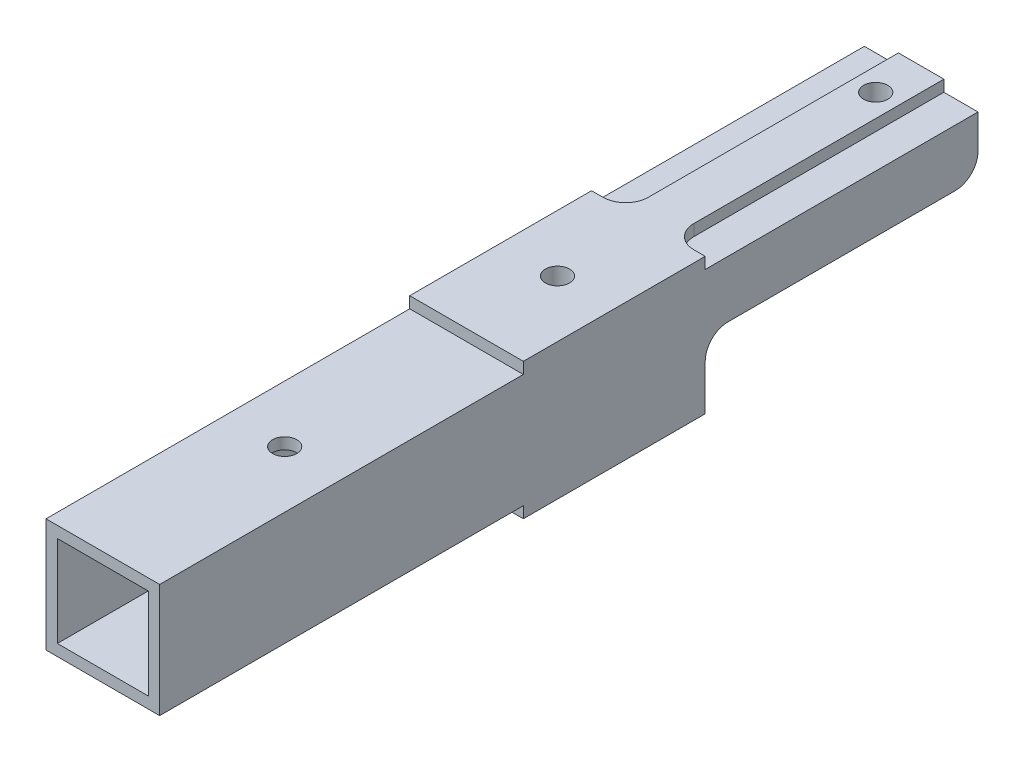
ISO-10303-21;
HEADER;
FILE_DESCRIPTION(('STEP AP214'),'2;1');
FILE_NAME('part.step','',(''),(''),'','','');
FILE_SCHEMA(('AUTOMOTIVE_DESIGN { 1 0 10303 214 1 1 1 1 }'));
ENDSEC;
DATA;
#1=APPLICATION_CONTEXT('core data for automotive mechanical design processes');
#2=APPLICATION_PROTOCOL_DEFINITION('international standard','automotive_design',2000,#1);
#3=PRODUCT_CONTEXT('',#1,'mechanical');
#4=PRODUCT('Part','Part','',(#3));
#5=PRODUCT_RELATED_PRODUCT_CATEGORY('part','',(#4));
#6=PRODUCT_DEFINITION_FORMATION('','',#4);
#7=PRODUCT_DEFINITION_CONTEXT('part definition',#1,'design');
#8=PRODUCT_DEFINITION('design','',#6,#7);
#9=PRODUCT_DEFINITION_SHAPE('','',#8);
#10=(LENGTH_UNIT() NAMED_UNIT(*) SI_UNIT(.MILLI.,.METRE.));
#11=(NAMED_UNIT(*) PLANE_ANGLE_UNIT() SI_UNIT($,.RADIAN.));
#12=(NAMED_UNIT(*) SI_UNIT($,.STERADIAN.) SOLID_ANGLE_UNIT());
#13=UNCERTAINTY_MEASURE_WITH_UNIT(LENGTH_MEASURE(1.E-05),#10,'distance_accuracy_value','');
#14=(GEOMETRIC_REPRESENTATION_CONTEXT(3) GLOBAL_UNCERTAINTY_ASSIGNED_CONTEXT((#13)) GLOBAL_UNIT_ASSIGNED_CONTEXT((#10,
#11,#12)) REPRESENTATION_CONTEXT('',''));
#15=CARTESIAN_POINT('',(0.,0.,0.));
#16=DIRECTION('',(0.,0.,1.));
#17=DIRECTION('',(1.,0.,0.));
#18=AXIS2_PLACEMENT_3D('',#15,#16,#17);
#19=CARTESIAN_POINT('',(-19.05,-19.05,-228.6));
#20=DIRECTION('',(0.,-1.,0.));
#21=DIRECTION('',(0.,0.,-1.));
#22=AXIS2_PLACEMENT_3D('',#19,#20,#21);
#23=PLANE('',#22);
#24=DIRECTION('',(0.,0.,-1.));
#25=VECTOR('',#24,1.);
#26=CARTESIAN_POINT('',(-15.875,-19.05,0.));
#27=LINE('',#26,#25);
#28=CARTESIAN_POINT('',(-15.875,-19.05,-101.6));
#29=VERTEX_POINT('',#28);
#30=CARTESIAN_POINT('',(-15.875,-19.05,-152.4));
#31=VERTEX_POINT('',#30);
#32=EDGE_CURVE('E357',#29,#31,#27,.T.);
#33=ORIENTED_EDGE('',*,*,#32,.T.);
#34=DIRECTION('',(1.,0.,0.));
#35=VECTOR('',#34,1.);
#36=CARTESIAN_POINT('',(19.05,-19.05,-152.4));
#37=LINE('',#36,#35);
#38=CARTESIAN_POINT('',(15.875,-19.05,-152.4));
#39=VERTEX_POINT('',#38);
#40=EDGE_CURVE('E402',#31,#39,#37,.T.);
#41=ORIENTED_EDGE('',*,*,#40,.T.);
#42=DIRECTION('',(0.,0.,-1.));
#43=VECTOR('',#42,1.);
#44=CARTESIAN_POINT('',(15.875,-19.05,0.));
#45=LINE('',#44,#43);
#46=CARTESIAN_POINT('',(15.875,-19.05,-101.6));
#47=VERTEX_POINT('',#46);
#48=EDGE_CURVE('E335',#47,#39,#45,.T.);
#49=ORIENTED_EDGE('',*,*,#48,.F.);
#50=DIRECTION('',(-1.,0.,0.));
#51=VECTOR('',#50,1.);
#52=CARTESIAN_POINT('',(-19.05,-19.05,-101.6));
#53=LINE('',#52,#51);
#54=EDGE_CURVE('E405',#47,#29,#53,.T.);
#55=ORIENTED_EDGE('',*,*,#54,.T.);
#56=EDGE_LOOP('',(#33,#41,#49,#55));
#57=FACE_BOUND('',#56,.T.);
#58=CARTESIAN_POINT('',(0.,-19.05,-127.));
#59=DIRECTION('',(0.,1.,0.));
#60=DIRECTION('',(0.,0.,1.));
#61=AXIS2_PLACEMENT_3D('',#58,#59,#60);
#62=CIRCLE('',#61,3.37819999999999);
#63=CARTESIAN_POINT('',(0.,-19.05,-123.6218));
#64=VERTEX_POINT('',#63);
#65=EDGE_CURVE('E453',#64,#64,#62,.T.);
#66=ORIENTED_EDGE('',*,*,#65,.T.);
#67=EDGE_LOOP('',(#66));
#68=FACE_BOUND('',#67,.T.);
#69=ADVANCED_FACE('F32',(#57,#68),#23,.T.);
#70=CARTESIAN_POINT('',(19.05,19.05,-228.6));
#71=DIRECTION('',(0.,0.,-1.));
#72=DIRECTION('',(-1.,0.,0.));
#73=AXIS2_PLACEMENT_3D('',#70,#71,#72);
#74=PLANE('',#73);
#75=DIRECTION('',(0.,-1.,0.));
#76=VECTOR('',#75,1.);
#77=CARTESIAN_POINT('',(-12.7,-12.7,-228.6));
#78=LINE('',#77,#76);
#79=CARTESIAN_POINT('',(-12.7,12.7,-228.6));
#80=VERTEX_POINT('',#79);
#81=CARTESIAN_POINT('',(-12.7,6.34999999999999,-228.6));
#82=VERTEX_POINT('',#81);
#83=EDGE_CURVE('E463',#80,#82,#78,.T.);
#84=ORIENTED_EDGE('',*,*,#83,.T.);
#85=DIRECTION('',(1.,0.,0.));
#86=VECTOR('',#85,1.);
#87=CARTESIAN_POINT('',(-15.875,6.34999999999999,-228.6));
#88=LINE('',#87,#86);
#89=CARTESIAN_POINT('',(-15.875,6.34999999999999,-228.6));
#90=VERTEX_POINT('',#89);
#91=EDGE_CURVE('E315',#82,#90,#88,.F.);
#92=ORIENTED_EDGE('',*,*,#91,.T.);
#93=DIRECTION('',(0.,1.,0.));
#94=VECTOR('',#93,1.);
#95=CARTESIAN_POINT('',(-15.875,19.05,-228.6));
#96=LINE('',#95,#94);
#97=CARTESIAN_POINT('',(-15.875,15.875,-228.6));
#98=VERTEX_POINT('',#97);
#99=EDGE_CURVE('E355',#90,#98,#96,.T.);
#100=ORIENTED_EDGE('',*,*,#99,.T.);
#101=DIRECTION('',(-1.,0.,0.));
#102=VECTOR('',#101,1.);
#103=CARTESIAN_POINT('',(-19.05,15.875,-228.6));
#104=LINE('',#103,#102);
#105=CARTESIAN_POINT('',(-6.34999999999997,15.875,-228.6));
#106=VERTEX_POINT('',#105);
#107=EDGE_CURVE('E437',#106,#98,#104,.T.);
#108=ORIENTED_EDGE('',*,*,#107,.F.);
#109=DIRECTION('',(0.,1.,0.));
#110=VECTOR('',#109,1.);
#111=CARTESIAN_POINT('',(-6.34999999999999,15.875,-228.6));
#112=LINE('',#111,#110);
#113=CARTESIAN_POINT('',(-6.34999999999999,19.05,-228.6));
#114=VERTEX_POINT('',#113);
#115=EDGE_CURVE('E440',#106,#114,#112,.T.);
#116=ORIENTED_EDGE('',*,*,#115,.T.);
#117=DIRECTION('',(-1.,0.,0.));
#118=VECTOR('',#117,1.);
#119=CARTESIAN_POINT('',(-19.05,19.05,-228.6));
#120=LINE('',#119,#118);
#121=CARTESIAN_POINT('',(6.35,19.05,-228.6));
#122=VERTEX_POINT('',#121);
#123=EDGE_CURVE('E251',#122,#114,#120,.T.);
#124=ORIENTED_EDGE('',*,*,#123,.F.);
#125=DIRECTION('',(0.,1.,0.));
#126=VECTOR('',#125,1.);
#127=CARTESIAN_POINT('',(6.35,15.875,-228.6));
#128=LINE('',#127,#126);
#129=CARTESIAN_POINT('',(6.35,15.875,-228.6));
#130=VERTEX_POINT('',#129);
#131=EDGE_CURVE('E419',#130,#122,#128,.T.);
#132=ORIENTED_EDGE('',*,*,#131,.F.);
#133=DIRECTION('',(-1.,0.,0.));
#134=VECTOR('',#133,1.);
#135=CARTESIAN_POINT('',(19.05,15.875,-228.6));
#136=LINE('',#135,#134);
#137=CARTESIAN_POINT('',(15.875,15.875,-228.6));
#138=VERTEX_POINT('',#137);
#139=EDGE_CURVE('E333',#138,#130,#136,.T.);
#140=ORIENTED_EDGE('',*,*,#139,.F.);
#141=DIRECTION('',(0.,1.,0.));
#142=VECTOR('',#141,1.);
#143=CARTESIAN_POINT('',(15.875,19.05,-228.6));
#144=LINE('',#143,#142);
#145=CARTESIAN_POINT('',(15.875,6.34999999999999,-228.6));
#146=VERTEX_POINT('',#145);
#147=EDGE_CURVE('E325',#146,#138,#144,.T.);
#148=ORIENTED_EDGE('',*,*,#147,.F.);
#149=DIRECTION('',(1.,0.,0.));
#150=VECTOR('',#149,1.);
#151=CARTESIAN_POINT('',(12.7,6.34999999999999,-228.6));
#152=LINE('',#151,#150);
#153=CARTESIAN_POINT('',(12.7,6.34999999999999,-228.6));
#154=VERTEX_POINT('',#153);
#155=EDGE_CURVE('E313',#146,#154,#152,.F.);
#156=ORIENTED_EDGE('',*,*,#155,.T.);
#157=DIRECTION('',(0.,1.,0.));
#158=VECTOR('',#157,1.);
#159=CARTESIAN_POINT('',(12.7,-12.7,-228.6));
#160=LINE('',#159,#158);
#161=CARTESIAN_POINT('',(12.7,12.7,-228.6));
#162=VERTEX_POINT('',#161);
#163=EDGE_CURVE('E465',#154,#162,#160,.T.);
#164=ORIENTED_EDGE('',*,*,#163,.T.);
#165=DIRECTION('',(-1.,0.,0.));
#166=VECTOR('',#165,1.);
#167=CARTESIAN_POINT('',(-12.7,12.7,-228.6));
#168=LINE('',#167,#166);
#169=EDGE_CURVE('E247',#162,#80,#168,.T.);
#170=ORIENTED_EDGE('',*,*,#169,.T.);
#171=EDGE_LOOP('',(#84,#92,#100,#108,#116,#124,#132,#140,#148,#156,#164,#170));
#172=FACE_BOUND('',#171,.T.);
#173=ADVANCED_FACE('F331',(#172),#74,.T.);
#174=CARTESIAN_POINT('',(19.05,19.05,0.));
#175=DIRECTION('',(0.,0.,-1.));
#176=DIRECTION('',(-1.,0.,0.));
#177=AXIS2_PLACEMENT_3D('',#174,#175,#176);
#178=PLANE('',#177);
#179=DIRECTION('',(1.,0.,0.));
#180=VECTOR('',#179,1.);
#181=CARTESIAN_POINT('',(-12.7,-12.7,0.));
#182=LINE('',#181,#180);
#183=CARTESIAN_POINT('',(-12.7,-12.7,0.));
#184=VERTEX_POINT('',#183);
#185=CARTESIAN_POINT('',(12.7,-12.7,0.));
#186=VERTEX_POINT('',#185);
#187=EDGE_CURVE('E240',#184,#186,#182,.T.);
#188=ORIENTED_EDGE('',*,*,#187,.F.);
#189=DIRECTION('',(0.,-1.,0.));
#190=VECTOR('',#189,1.);
#191=CARTESIAN_POINT('',(-12.7,-12.7,0.));
#192=LINE('',#191,#190);
#193=CARTESIAN_POINT('',(-12.7,12.7,0.));
#194=VERTEX_POINT('',#193);
#195=EDGE_CURVE('E462',#194,#184,#192,.T.);
#196=ORIENTED_EDGE('',*,*,#195,.F.);
#197=DIRECTION('',(-1.,0.,0.));
#198=VECTOR('',#197,1.);
#199=CARTESIAN_POINT('',(-12.7,12.7,0.));
#200=LINE('',#199,#198);
#201=CARTESIAN_POINT('',(12.7,12.7,0.));
#202=VERTEX_POINT('',#201);
#203=EDGE_CURVE('E466',#202,#194,#200,.T.);
#204=ORIENTED_EDGE('',*,*,#203,.F.);
#205=DIRECTION('',(0.,1.,0.));
#206=VECTOR('',#205,1.);
#207=CARTESIAN_POINT('',(12.7,-12.7,0.));
#208=LINE('',#207,#206);
#209=EDGE_CURVE('E473',#186,#202,#208,.T.);
#210=ORIENTED_EDGE('',*,*,#209,.F.);
#211=EDGE_LOOP('',(#188,#196,#204,#210));
#212=FACE_BOUND('',#211,.T.);
#213=DIRECTION('',(0.,-1.,0.));
#214=VECTOR('',#213,1.);
#215=CARTESIAN_POINT('',(-15.875,19.05,0.));
#216=LINE('',#215,#214);
#217=CARTESIAN_POINT('',(-15.875,15.875,0.));
#218=VERTEX_POINT('',#217);
#219=CARTESIAN_POINT('',(-15.875,-15.875,0.));
#220=VERTEX_POINT('',#219);
#221=EDGE_CURVE('E349',#218,#220,#216,.T.);
#222=ORIENTED_EDGE('',*,*,#221,.T.);
#223=DIRECTION('',(1.,0.,0.));
#224=VECTOR('',#223,1.);
#225=CARTESIAN_POINT('',(-19.05,-15.875,0.));
#226=LINE('',#225,#224);
#227=CARTESIAN_POINT('',(15.875,-15.875,0.));
#228=VERTEX_POINT('',#227);
#229=EDGE_CURVE('E272',#220,#228,#226,.T.);
#230=ORIENTED_EDGE('',*,*,#229,.T.);
#231=DIRECTION('',(0.,-1.,0.));
#232=VECTOR('',#231,1.);
#233=CARTESIAN_POINT('',(15.875,19.05,0.));
#234=LINE('',#233,#232);
#235=CARTESIAN_POINT('',(15.875,15.875,0.));
#236=VERTEX_POINT('',#235);
#237=EDGE_CURVE('E378',#236,#228,#234,.T.);
#238=ORIENTED_EDGE('',*,*,#237,.F.);
#239=DIRECTION('',(1.,0.,0.));
#240=VECTOR('',#239,1.);
#241=CARTESIAN_POINT('',(-19.05,15.875,0.));
#242=LINE('',#241,#240);
#243=EDGE_CURVE('E425',#218,#236,#242,.T.);
#244=ORIENTED_EDGE('',*,*,#243,.F.);
#245=EDGE_LOOP('',(#222,#230,#238,#244));
#246=FACE_BOUND('',#245,.T.);
#247=ADVANCED_FACE('F486',(#212,#246),#178,.F.);
#248=CARTESIAN_POINT('',(-19.05,19.05,-228.6));
#249=DIRECTION('',(0.,1.,0.));
#250=DIRECTION('',(0.,0.,1.));
#251=AXIS2_PLACEMENT_3D('',#248,#249,#250);
#252=PLANE('',#251);
#253=CARTESIAN_POINT('',(0.,19.05,-215.9));
#254=DIRECTION('',(0.,1.,0.));
#255=DIRECTION('',(0.,0.,1.));
#256=AXIS2_PLACEMENT_3D('',#253,#254,#255);
#257=CIRCLE('',#256,3.37819999999999);
#258=CARTESIAN_POINT('',(0.,19.05,-212.5218));
#259=VERTEX_POINT('',#258);
#260=EDGE_CURVE('E262',#259,#259,#257,.T.);
#261=ORIENTED_EDGE('',*,*,#260,.F.);
#262=EDGE_LOOP('',(#261));
#263=FACE_BOUND('',#262,.T.);
#264=CARTESIAN_POINT('',(0.,19.05,-127.));
#265=DIRECTION('',(0.,1.,0.));
#266=DIRECTION('',(0.,0.,1.));
#267=AXIS2_PLACEMENT_3D('',#264,#265,#266);
#268=CIRCLE('',#267,3.37819999999999);
#269=CARTESIAN_POINT('',(0.,19.05,-123.6218));
#270=VERTEX_POINT('',#269);
#271=EDGE_CURVE('E450',#270,#270,#268,.T.);
#272=ORIENTED_EDGE('',*,*,#271,.F.);
#273=EDGE_LOOP('',(#272));
#274=FACE_BOUND('',#273,.T.);
#275=DIRECTION('',(1.,0.,0.));
#276=VECTOR('',#275,1.);
#277=CARTESIAN_POINT('',(-19.05,19.05,-152.4));
#278=LINE('',#277,#276);
#279=CARTESIAN_POINT('',(-15.875,19.05,-152.4));
#280=VERTEX_POINT('',#279);
#281=CARTESIAN_POINT('',(-12.7,19.05,-152.4));
#282=VERTEX_POINT('',#281);
#283=EDGE_CURVE('E266',#280,#282,#278,.T.);
#284=ORIENTED_EDGE('',*,*,#283,.F.);
#285=DIRECTION('',(0.,0.,1.));
#286=VECTOR('',#285,1.);
#287=CARTESIAN_POINT('',(-15.875,19.05,0.));
#288=LINE('',#287,#286);
#289=CARTESIAN_POINT('',(-15.875,19.05,-101.6));
#290=VERTEX_POINT('',#289);
#291=EDGE_CURVE('E352',#280,#290,#288,.T.);
#292=ORIENTED_EDGE('',*,*,#291,.T.);
#293=DIRECTION('',(-1.,0.,0.));
#294=VECTOR('',#293,1.);
#295=CARTESIAN_POINT('',(-19.05,19.05,-101.6));
#296=LINE('',#295,#294);
#297=CARTESIAN_POINT('',(15.875,19.05,-101.6));
#298=VERTEX_POINT('',#297);
#299=EDGE_CURVE('E424',#298,#290,#296,.T.);
#300=ORIENTED_EDGE('',*,*,#299,.F.);
#301=DIRECTION('',(0.,0.,1.));
#302=VECTOR('',#301,1.);
#303=CARTESIAN_POINT('',(15.875,19.05,0.));
#304=LINE('',#303,#302);
#305=CARTESIAN_POINT('',(15.875,19.05,-152.4));
#306=VERTEX_POINT('',#305);
#307=EDGE_CURVE('E334',#306,#298,#304,.T.);
#308=ORIENTED_EDGE('',*,*,#307,.F.);
#309=DIRECTION('',(1.,0.,0.));
#310=VECTOR('',#309,1.);
#311=CARTESIAN_POINT('',(19.05,19.05,-152.4));
#312=LINE('',#311,#310);
#313=CARTESIAN_POINT('',(12.7,19.05,-152.4));
#314=VERTEX_POINT('',#313);
#315=EDGE_CURVE('E414',#314,#306,#312,.T.);
#316=ORIENTED_EDGE('',*,*,#315,.F.);
#317=CARTESIAN_POINT('',(12.7,19.05,-158.75));
#318=DIRECTION('',(0.,1.,0.));
#319=DIRECTION('',(0.,0.,1.));
#320=AXIS2_PLACEMENT_3D('',#317,#318,#319);
#321=CIRCLE('',#320,6.35);
#322=CARTESIAN_POINT('',(6.35000000000001,19.05,-158.75));
#323=VERTEX_POINT('',#322);
#324=EDGE_CURVE('E288',#314,#323,#321,.F.);
#325=ORIENTED_EDGE('',*,*,#324,.T.);
#326=DIRECTION('',(0.,0.,1.));
#327=VECTOR('',#326,1.);
#328=CARTESIAN_POINT('',(6.35,19.05,-228.6));
#329=LINE('',#328,#327);
#330=EDGE_CURVE('E271',#122,#323,#329,.T.);
#331=ORIENTED_EDGE('',*,*,#330,.F.);
#332=ORIENTED_EDGE('',*,*,#123,.T.);
#333=DIRECTION('',(0.,0.,-1.));
#334=VECTOR('',#333,1.);
#335=CARTESIAN_POINT('',(-6.34999999999999,19.05,-228.6));
#336=LINE('',#335,#334);
#337=CARTESIAN_POINT('',(-6.34999999999997,19.05,-158.75));
#338=VERTEX_POINT('',#337);
#339=EDGE_CURVE('E435',#338,#114,#336,.T.);
#340=ORIENTED_EDGE('',*,*,#339,.F.);
#341=CARTESIAN_POINT('',(-12.7,19.05,-158.75));
#342=DIRECTION('',(0.,1.,0.));
#343=DIRECTION('',(0.,0.,1.));
#344=AXIS2_PLACEMENT_3D('',#341,#342,#343);
#345=CIRCLE('',#344,6.35);
#346=EDGE_CURVE('E286',#338,#282,#345,.F.);
#347=ORIENTED_EDGE('',*,*,#346,.T.);
#348=EDGE_LOOP('',(#284,#292,#300,#308,#316,#325,#331,#332,#340,#347));
#349=FACE_BOUND('',#348,.T.);
#350=ADVANCED_FACE('F532',(#263,#274,#349),#252,.T.);
#351=CARTESIAN_POINT('',(-19.05,15.875,0.));
#352=DIRECTION('',(0.,1.,0.));
#353=DIRECTION('',(0.,0.,1.));
#354=AXIS2_PLACEMENT_3D('',#351,#352,#353);
#355=PLANE('',#354);
#356=CARTESIAN_POINT('',(0.,15.875,-50.8));
#357=DIRECTION('',(0.,1.,0.));
#358=DIRECTION('',(0.,0.,1.));
#359=AXIS2_PLACEMENT_3D('',#356,#357,#358);
#360=CIRCLE('',#359,3.37819999999999);
#361=CARTESIAN_POINT('',(0.,15.875,-47.4218));
#362=VERTEX_POINT('',#361);
#363=EDGE_CURVE('E263',#362,#362,#360,.F.);
#364=ORIENTED_EDGE('',*,*,#363,.T.);
#365=EDGE_LOOP('',(#364));
#366=FACE_BOUND('',#365,.T.);
#367=DIRECTION('',(-1.,0.,0.));
#368=VECTOR('',#367,1.);
#369=CARTESIAN_POINT('',(-19.05,15.875,-101.6));
#370=LINE('',#369,#368);
#371=CARTESIAN_POINT('',(15.875,15.875,-101.6));
#372=VERTEX_POINT('',#371);
#373=CARTESIAN_POINT('',(-15.875,15.875,-101.6));
#374=VERTEX_POINT('',#373);
#375=EDGE_CURVE('E267',#372,#374,#370,.T.);
#376=ORIENTED_EDGE('',*,*,#375,.T.);
#377=DIRECTION('',(0.,0.,1.));
#378=VECTOR('',#377,1.);
#379=CARTESIAN_POINT('',(-15.875,15.875,0.));
#380=LINE('',#379,#378);
#381=EDGE_CURVE('E375',#374,#218,#380,.T.);
#382=ORIENTED_EDGE('',*,*,#381,.T.);
#383=ORIENTED_EDGE('',*,*,#243,.T.);
#384=DIRECTION('',(0.,0.,-1.));
#385=VECTOR('',#384,1.);
#386=CARTESIAN_POINT('',(15.875,15.875,0.));
#387=LINE('',#386,#385);
#388=EDGE_CURVE('E399',#236,#372,#387,.T.);
#389=ORIENTED_EDGE('',*,*,#388,.T.);
#390=EDGE_LOOP('',(#376,#382,#383,#389));
#391=FACE_BOUND('',#390,.T.);
#392=ADVANCED_FACE('F522',(#366,#391),#355,.T.);
#393=CARTESIAN_POINT('',(-19.05,15.875,-101.6));
#394=DIRECTION('',(0.,0.,-1.));
#395=DIRECTION('',(-1.,0.,0.));
#396=AXIS2_PLACEMENT_3D('',#393,#394,#395);
#397=PLANE('',#396);
#398=DIRECTION('',(0.,1.,0.));
#399=VECTOR('',#398,1.);
#400=CARTESIAN_POINT('',(-15.875,15.875,-101.6));
#401=LINE('',#400,#399);
#402=EDGE_CURVE('E373',#374,#290,#401,.T.);
#403=ORIENTED_EDGE('',*,*,#402,.F.);
#404=ORIENTED_EDGE('',*,*,#375,.F.);
#405=DIRECTION('',(0.,-1.,0.));
#406=VECTOR('',#405,1.);
#407=CARTESIAN_POINT('',(15.875,15.875,-101.6));
#408=LINE('',#407,#406);
#409=EDGE_CURVE('E397',#298,#372,#408,.T.);
#410=ORIENTED_EDGE('',*,*,#409,.F.);
#411=ORIENTED_EDGE('',*,*,#299,.T.);
#412=EDGE_LOOP('',(#403,#404,#410,#411));
#413=FACE_BOUND('',#412,.T.);
#414=ADVANCED_FACE('F529',(#413),#397,.F.);
#415=CARTESIAN_POINT('',(-19.05,-15.875,0.));
#416=DIRECTION('',(0.,-1.,0.));
#417=DIRECTION('',(0.,0.,1.));
#418=AXIS2_PLACEMENT_3D('',#415,#416,#417);
#419=PLANE('',#418);
#420=CARTESIAN_POINT('',(0.,-15.875,-50.8));
#421=DIRECTION('',(0.,-1.,0.));
#422=DIRECTION('',(0.,0.,-1.));
#423=AXIS2_PLACEMENT_3D('',#420,#421,#422);
#424=CIRCLE('',#423,3.37819999999999);
#425=CARTESIAN_POINT('',(0.,-15.875,-54.1782));
#426=VERTEX_POINT('',#425);
#427=EDGE_CURVE('E268',#426,#426,#424,.F.);
#428=ORIENTED_EDGE('',*,*,#427,.T.);
#429=EDGE_LOOP('',(#428));
#430=FACE_BOUND('',#429,.T.);
#431=ORIENTED_EDGE('',*,*,#229,.F.);
#432=DIRECTION('',(0.,0.,-1.));
#433=VECTOR('',#432,1.);
#434=CARTESIAN_POINT('',(-15.875,-15.875,0.));
#435=LINE('',#434,#433);
#436=CARTESIAN_POINT('',(-15.875,-15.875,-101.6));
#437=VERTEX_POINT('',#436);
#438=EDGE_CURVE('E370',#220,#437,#435,.T.);
#439=ORIENTED_EDGE('',*,*,#438,.T.);
#440=DIRECTION('',(-1.,0.,0.));
#441=VECTOR('',#440,1.);
#442=CARTESIAN_POINT('',(-19.05,-15.875,-101.6));
#443=LINE('',#442,#441);
#444=CARTESIAN_POINT('',(15.875,-15.875,-101.6));
#445=VERTEX_POINT('',#444);
#446=EDGE_CURVE('E406',#445,#437,#443,.T.);
#447=ORIENTED_EDGE('',*,*,#446,.F.);
#448=DIRECTION('',(0.,0.,1.));
#449=VECTOR('',#448,1.);
#450=CARTESIAN_POINT('',(15.875,-15.875,0.));
#451=LINE('',#450,#449);
#452=EDGE_CURVE('E389',#445,#228,#451,.T.);
#453=ORIENTED_EDGE('',*,*,#452,.T.);
#454=EDGE_LOOP('',(#431,#439,#447,#453));
#455=FACE_BOUND('',#454,.T.);
#456=ADVANCED_FACE('F517',(#430,#455),#419,.T.);
#457=CARTESIAN_POINT('',(-19.05,-15.875,-101.6));
#458=DIRECTION('',(0.,0.,1.));
#459=DIRECTION('',(1.,0.,0.));
#460=AXIS2_PLACEMENT_3D('',#457,#458,#459);
#461=PLANE('',#460);
#462=ORIENTED_EDGE('',*,*,#446,.T.);
#463=DIRECTION('',(0.,-1.,0.));
#464=VECTOR('',#463,1.);
#465=CARTESIAN_POINT('',(-15.875,-15.875,-101.6));
#466=LINE('',#465,#464);
#467=EDGE_CURVE('E367',#437,#29,#466,.T.);
#468=ORIENTED_EDGE('',*,*,#467,.T.);
#469=ORIENTED_EDGE('',*,*,#54,.F.);
#470=DIRECTION('',(0.,1.,0.));
#471=VECTOR('',#470,1.);
#472=CARTESIAN_POINT('',(15.875,-15.875,-101.6));
#473=LINE('',#472,#471);
#474=EDGE_CURVE('E386',#47,#445,#473,.T.);
#475=ORIENTED_EDGE('',*,*,#474,.T.);
#476=EDGE_LOOP('',(#462,#468,#469,#475));
#477=FACE_BOUND('',#476,.T.);
#478=ADVANCED_FACE('F513',(#477),#461,.T.);
#479=CARTESIAN_POINT('',(-19.05,15.875,-152.4));
#480=DIRECTION('',(0.,0.,1.));
#481=DIRECTION('',(1.,0.,0.));
#482=AXIS2_PLACEMENT_3D('',#479,#480,#481);
#483=PLANE('',#482);
#484=ORIENTED_EDGE('',*,*,#283,.T.);
#485=DIRECTION('',(0.,1.,0.));
#486=VECTOR('',#485,1.);
#487=CARTESIAN_POINT('',(-12.7,15.875,-152.4));
#488=LINE('',#487,#486);
#489=CARTESIAN_POINT('',(-12.7,15.875,-152.4));
#490=VERTEX_POINT('',#489);
#491=EDGE_CURVE('E275',#282,#490,#488,.F.);
#492=ORIENTED_EDGE('',*,*,#491,.T.);
#493=DIRECTION('',(1.,0.,0.));
#494=VECTOR('',#493,1.);
#495=CARTESIAN_POINT('',(-19.05,15.875,-152.4));
#496=LINE('',#495,#494);
#497=CARTESIAN_POINT('',(-15.875,15.875,-152.4));
#498=VERTEX_POINT('',#497);
#499=EDGE_CURVE('E431',#498,#490,#496,.T.);
#500=ORIENTED_EDGE('',*,*,#499,.F.);
#501=DIRECTION('',(0.,-1.,0.));
#502=VECTOR('',#501,1.);
#503=CARTESIAN_POINT('',(-15.875,15.875,-152.4));
#504=LINE('',#503,#502);
#505=EDGE_CURVE('E365',#280,#498,#504,.T.);
#506=ORIENTED_EDGE('',*,*,#505,.F.);
#507=EDGE_LOOP('',(#484,#492,#500,#506));
#508=FACE_BOUND('',#507,.T.);
#509=ADVANCED_FACE('F537',(#508),#483,.F.);
#510=CARTESIAN_POINT('',(-19.05,15.875,-152.4));
#511=DIRECTION('',(0.,1.,0.));
#512=DIRECTION('',(0.,0.,1.));
#513=AXIS2_PLACEMENT_3D('',#510,#511,#512);
#514=PLANE('',#513);
#515=ORIENTED_EDGE('',*,*,#499,.T.);
#516=CARTESIAN_POINT('',(-12.7,15.875,-158.75));
#517=DIRECTION('',(0.,1.,0.));
#518=DIRECTION('',(0.,0.,1.));
#519=AXIS2_PLACEMENT_3D('',#516,#517,#518);
#520=CIRCLE('',#519,6.35);
#521=CARTESIAN_POINT('',(-6.34999999999997,15.875,-158.75));
#522=VERTEX_POINT('',#521);
#523=EDGE_CURVE('E277',#490,#522,#520,.T.);
#524=ORIENTED_EDGE('',*,*,#523,.T.);
#525=DIRECTION('',(0.,0.,-1.));
#526=VECTOR('',#525,1.);
#527=CARTESIAN_POINT('',(-6.34999999999999,15.875,-228.6));
#528=LINE('',#527,#526);
#529=EDGE_CURVE('E434',#522,#106,#528,.T.);
#530=ORIENTED_EDGE('',*,*,#529,.T.);
#531=ORIENTED_EDGE('',*,*,#107,.T.);
#532=DIRECTION('',(0.,0.,1.));
#533=VECTOR('',#532,1.);
#534=CARTESIAN_POINT('',(-15.875,15.875,-152.4));
#535=LINE('',#534,#533);
#536=EDGE_CURVE('E362',#98,#498,#535,.T.);
#537=ORIENTED_EDGE('',*,*,#536,.T.);
#538=EDGE_LOOP('',(#515,#524,#530,#531,#537));
#539=FACE_BOUND('',#538,.T.);
#540=ADVANCED_FACE('F541',(#539),#514,.T.);
#541=CARTESIAN_POINT('',(19.05,15.875,-152.4));
#542=DIRECTION('',(0.,0.,1.));
#543=DIRECTION('',(1.,0.,0.));
#544=AXIS2_PLACEMENT_3D('',#541,#542,#543);
#545=PLANE('',#544);
#546=DIRECTION('',(1.,0.,0.));
#547=VECTOR('',#546,1.);
#548=CARTESIAN_POINT('',(19.05,15.875,-152.4));
#549=LINE('',#548,#547);
#550=CARTESIAN_POINT('',(12.7,15.875,-152.4));
#551=VERTEX_POINT('',#550);
#552=CARTESIAN_POINT('',(15.875,15.875,-152.4));
#553=VERTEX_POINT('',#552);
#554=EDGE_CURVE('E417',#551,#553,#549,.T.);
#555=ORIENTED_EDGE('',*,*,#554,.F.);
#556=DIRECTION('',(0.,1.,0.));
#557=VECTOR('',#556,1.);
#558=CARTESIAN_POINT('',(12.7,19.05,-152.4));
#559=LINE('',#558,#557);
#560=EDGE_CURVE('E279',#551,#314,#559,.T.);
#561=ORIENTED_EDGE('',*,*,#560,.T.);
#562=ORIENTED_EDGE('',*,*,#315,.T.);
#563=DIRECTION('',(0.,1.,0.));
#564=VECTOR('',#563,1.);
#565=CARTESIAN_POINT('',(15.875,15.875,-152.4));
#566=LINE('',#565,#564);
#567=EDGE_CURVE('E394',#553,#306,#566,.T.);
#568=ORIENTED_EDGE('',*,*,#567,.F.);
#569=EDGE_LOOP('',(#555,#561,#562,#568));
#570=FACE_BOUND('',#569,.T.);
#571=ADVANCED_FACE('F565',(#570),#545,.F.);
#572=CARTESIAN_POINT('',(19.05,15.875,-152.4));
#573=DIRECTION('',(0.,-1.,0.));
#574=DIRECTION('',(0.,0.,-1.));
#575=AXIS2_PLACEMENT_3D('',#572,#573,#574);
#576=PLANE('',#575);
#577=DIRECTION('',(0.,0.,1.));
#578=VECTOR('',#577,1.);
#579=CARTESIAN_POINT('',(6.35,15.875,-228.6));
#580=LINE('',#579,#578);
#581=CARTESIAN_POINT('',(6.35000000000001,15.875,-158.75));
#582=VERTEX_POINT('',#581);
#583=EDGE_CURVE('E413',#130,#582,#580,.T.);
#584=ORIENTED_EDGE('',*,*,#583,.T.);
#585=CARTESIAN_POINT('',(12.7,15.875,-158.75));
#586=DIRECTION('',(0.,-1.,0.));
#587=DIRECTION('',(0.,0.,-1.));
#588=AXIS2_PLACEMENT_3D('',#585,#586,#587);
#589=CIRCLE('',#588,6.35);
#590=EDGE_CURVE('E284',#582,#551,#589,.F.);
#591=ORIENTED_EDGE('',*,*,#590,.T.);
#592=ORIENTED_EDGE('',*,*,#554,.T.);
#593=DIRECTION('',(0.,0.,1.));
#594=VECTOR('',#593,1.);
#595=CARTESIAN_POINT('',(15.875,15.875,-152.4));
#596=LINE('',#595,#594);
#597=EDGE_CURVE('E392',#138,#553,#596,.T.);
#598=ORIENTED_EDGE('',*,*,#597,.F.);
#599=ORIENTED_EDGE('',*,*,#139,.T.);
#600=EDGE_LOOP('',(#584,#591,#592,#598,#599));
#601=FACE_BOUND('',#600,.T.);
#602=ADVANCED_FACE('F559',(#601),#576,.F.);
#603=CARTESIAN_POINT('',(19.05,-15.875,-152.4));
#604=DIRECTION('',(0.,0.,-1.));
#605=DIRECTION('',(-1.,0.,0.));
#606=AXIS2_PLACEMENT_3D('',#603,#604,#605);
#607=PLANE('',#606);
#608=DIRECTION('',(0.,1.,0.));
#609=VECTOR('',#608,1.);
#610=CARTESIAN_POINT('',(-15.875,-15.875,-152.4));
#611=LINE('',#610,#609);
#612=CARTESIAN_POINT('',(-15.875,-6.35000000000001,-152.4));
#613=VERTEX_POINT('',#612);
#614=EDGE_CURVE('E360',#31,#613,#611,.T.);
#615=ORIENTED_EDGE('',*,*,#614,.T.);
#616=DIRECTION('',(1.,0.,0.));
#617=VECTOR('',#616,1.);
#618=CARTESIAN_POINT('',(19.05,-6.35000000000001,-152.4));
#619=LINE('',#618,#617);
#620=CARTESIAN_POINT('',(-12.7,-6.35000000000001,-152.4));
#621=VERTEX_POINT('',#620);
#622=EDGE_CURVE('E292',#613,#621,#619,.T.);
#623=ORIENTED_EDGE('',*,*,#622,.T.);
#624=DIRECTION('',(0.,1.,0.));
#625=VECTOR('',#624,1.);
#626=CARTESIAN_POINT('',(-12.7,-12.7,-152.4));
#627=LINE('',#626,#625);
#628=CARTESIAN_POINT('',(-12.7,-12.7,-152.4));
#629=VERTEX_POINT('',#628);
#630=EDGE_CURVE('E226',#629,#621,#627,.T.);
#631=ORIENTED_EDGE('',*,*,#630,.F.);
#632=DIRECTION('',(-1.,0.,0.));
#633=VECTOR('',#632,1.);
#634=CARTESIAN_POINT('',(-12.7,-12.7,-152.4));
#635=LINE('',#634,#633);
#636=CARTESIAN_POINT('',(12.7,-12.7,-152.4));
#637=VERTEX_POINT('',#636);
#638=EDGE_CURVE('E227',#637,#629,#635,.T.);
#639=ORIENTED_EDGE('',*,*,#638,.F.);
#640=DIRECTION('',(0.,-1.,0.));
#641=VECTOR('',#640,1.);
#642=CARTESIAN_POINT('',(12.7,-12.7,-152.4));
#643=LINE('',#642,#641);
#644=CARTESIAN_POINT('',(12.7,-6.35000000000001,-152.4));
#645=VERTEX_POINT('',#644);
#646=EDGE_CURVE('E214',#645,#637,#643,.T.);
#647=ORIENTED_EDGE('',*,*,#646,.F.);
#648=DIRECTION('',(1.,0.,0.));
#649=VECTOR('',#648,1.);
#650=CARTESIAN_POINT('',(19.05,-6.35000000000001,-152.4));
#651=LINE('',#650,#649);
#652=CARTESIAN_POINT('',(15.875,-6.35000000000001,-152.4));
#653=VERTEX_POINT('',#652);
#654=EDGE_CURVE('E290',#645,#653,#651,.T.);
#655=ORIENTED_EDGE('',*,*,#654,.T.);
#656=DIRECTION('',(0.,-1.,0.));
#657=VECTOR('',#656,1.);
#658=CARTESIAN_POINT('',(15.875,-15.875,-152.4));
#659=LINE('',#658,#657);
#660=EDGE_CURVE('E384',#653,#39,#659,.T.);
#661=ORIENTED_EDGE('',*,*,#660,.T.);
#662=ORIENTED_EDGE('',*,*,#40,.F.);
#663=EDGE_LOOP('',(#615,#623,#631,#639,#647,#655,#661,#662));
#664=FACE_BOUND('',#663,.T.);
#665=ADVANCED_FACE('F231',(#664),#607,.T.);
#666=CARTESIAN_POINT('',(0.,19.05,-50.8));
#667=DIRECTION('',(0.,1.,0.));
#668=DIRECTION('',(0.,0.,1.));
#669=AXIS2_PLACEMENT_3D('',#666,#667,#668);
#670=CYLINDRICAL_SURFACE('',#669,3.37819999999999);
#671=CARTESIAN_POINT('',(0.,-12.7,-50.8));
#672=DIRECTION('',(0.,-1.,0.));
#673=DIRECTION('',(0.,0.,-1.));
#674=AXIS2_PLACEMENT_3D('',#671,#672,#673);
#675=CIRCLE('',#674,3.37819999999999);
#676=CARTESIAN_POINT('',(0.,-12.7,-54.1782));
#677=VERTEX_POINT('',#676);
#678=EDGE_CURVE('E255',#677,#677,#675,.T.);
#679=ORIENTED_EDGE('',*,*,#678,.F.);
#680=EDGE_LOOP('',(#679));
#681=FACE_BOUND('',#680,.T.);
#682=ORIENTED_EDGE('',*,*,#427,.F.);
#683=EDGE_LOOP('',(#682));
#684=FACE_BOUND('',#683,.T.);
#685=ADVANCED_FACE('F693',(#681,#684),#670,.F.);
#686=CARTESIAN_POINT('',(0.,12.7,-50.8));
#687=DIRECTION('',(0.,1.,0.));
#688=DIRECTION('',(-1.,0.,0.));
#689=AXIS2_PLACEMENT_3D('',#686,#687,#688);
#690=CIRCLE('',#689,3.37819999999999);
#691=CARTESIAN_POINT('',(-3.3782,12.7,-50.8));
#692=VERTEX_POINT('',#691);
#693=EDGE_CURVE('E258',#692,#692,#690,.T.);
#694=ORIENTED_EDGE('',*,*,#693,.F.);
#695=EDGE_LOOP('',(#694));
#696=FACE_BOUND('',#695,.T.);
#697=ORIENTED_EDGE('',*,*,#363,.F.);
#698=EDGE_LOOP('',(#697));
#699=FACE_BOUND('',#698,.T.);
#700=ADVANCED_FACE('F666',(#696,#699),#670,.F.);
#701=CARTESIAN_POINT('',(-12.7,-12.7,-228.6));
#702=DIRECTION('',(-1.,0.,0.));
#703=DIRECTION('',(0.,0.,1.));
#704=AXIS2_PLACEMENT_3D('',#701,#702,#703);
#705=PLANE('',#704);
#706=DIRECTION('',(0.,0.,-1.));
#707=VECTOR('',#706,1.);
#708=CARTESIAN_POINT('',(-12.7,0.,-228.6));
#709=LINE('',#708,#707);
#710=CARTESIAN_POINT('',(-12.7,0.,-158.75));
#711=VERTEX_POINT('',#710);
#712=CARTESIAN_POINT('',(-12.7,0.,-222.25));
#713=VERTEX_POINT('',#712);
#714=EDGE_CURVE('E236',#711,#713,#709,.T.);
#715=ORIENTED_EDGE('',*,*,#714,.T.);
#716=CARTESIAN_POINT('',(-12.7,6.34999999999999,-222.25));
#717=DIRECTION('',(-1.,0.,0.));
#718=DIRECTION('',(0.,0.,1.));
#719=AXIS2_PLACEMENT_3D('',#716,#717,#718);
#720=CIRCLE('',#719,6.35);
#721=EDGE_CURVE('E311',#713,#82,#720,.F.);
#722=ORIENTED_EDGE('',*,*,#721,.T.);
#723=ORIENTED_EDGE('',*,*,#83,.F.);
#724=DIRECTION('',(0.,0.,1.));
#725=VECTOR('',#724,1.);
#726=CARTESIAN_POINT('',(-12.7,12.7,-228.6));
#727=LINE('',#726,#725);
#728=EDGE_CURVE('E245',#80,#194,#727,.T.);
#729=ORIENTED_EDGE('',*,*,#728,.T.);
#730=ORIENTED_EDGE('',*,*,#195,.T.);
#731=DIRECTION('',(0.,0.,1.));
#732=VECTOR('',#731,1.);
#733=CARTESIAN_POINT('',(-12.7,-12.7,-228.6));
#734=LINE('',#733,#732);
#735=EDGE_CURVE('E243',#629,#184,#734,.T.);
#736=ORIENTED_EDGE('',*,*,#735,.F.);
#737=ORIENTED_EDGE('',*,*,#630,.T.);
#738=CARTESIAN_POINT('',(-12.7,-6.35000000000001,-158.75));
#739=DIRECTION('',(-1.,0.,0.));
#740=DIRECTION('',(0.,0.,1.));
#741=AXIS2_PLACEMENT_3D('',#738,#739,#740);
#742=CIRCLE('',#741,6.35);
#743=EDGE_CURVE('E300',#621,#711,#742,.T.);
#744=ORIENTED_EDGE('',*,*,#743,.T.);
#745=EDGE_LOOP('',(#715,#722,#723,#729,#730,#736,#737,#744));
#746=FACE_BOUND('',#745,.T.);
#747=ADVANCED_FACE('F478',(#746),#705,.F.);
#748=CARTESIAN_POINT('',(-12.7,12.7,-228.6));
#749=DIRECTION('',(0.,1.,0.));
#750=DIRECTION('',(-1.,0.,0.));
#751=AXIS2_PLACEMENT_3D('',#748,#749,#750);
#752=PLANE('',#751);
#753=CARTESIAN_POINT('',(0.,12.7,-215.9));
#754=DIRECTION('',(0.,1.,0.));
#755=DIRECTION('',(-1.,0.,0.));
#756=AXIS2_PLACEMENT_3D('',#753,#754,#755);
#757=CIRCLE('',#756,3.37819999999999);
#758=CARTESIAN_POINT('',(-3.3782,12.7,-215.9));
#759=VERTEX_POINT('',#758);
#760=EDGE_CURVE('E259',#759,#759,#757,.T.);
#761=ORIENTED_EDGE('',*,*,#760,.T.);
#762=EDGE_LOOP('',(#761));
#763=FACE_BOUND('',#762,.T.);
#764=ORIENTED_EDGE('',*,*,#693,.T.);
#765=EDGE_LOOP('',(#764));
#766=FACE_BOUND('',#765,.T.);
#767=CARTESIAN_POINT('',(0.,12.7,-127.));
#768=DIRECTION('',(0.,1.,0.));
#769=DIRECTION('',(-1.,0.,0.));
#770=AXIS2_PLACEMENT_3D('',#767,#768,#769);
#771=CIRCLE('',#770,3.37819999999999);
#772=CARTESIAN_POINT('',(-3.3782,12.7,-127.));
#773=VERTEX_POINT('',#772);
#774=EDGE_CURVE('E459',#773,#773,#771,.T.);
#775=ORIENTED_EDGE('',*,*,#774,.T.);
#776=EDGE_LOOP('',(#775));
#777=FACE_BOUND('',#776,.T.);
#778=ORIENTED_EDGE('',*,*,#203,.T.);
#779=ORIENTED_EDGE('',*,*,#728,.F.);
#780=ORIENTED_EDGE('',*,*,#169,.F.);
#781=DIRECTION('',(0.,0.,1.));
#782=VECTOR('',#781,1.);
#783=CARTESIAN_POINT('',(12.7,12.7,-228.6));
#784=LINE('',#783,#782);
#785=EDGE_CURVE('E242',#162,#202,#784,.T.);
#786=ORIENTED_EDGE('',*,*,#785,.T.);
#787=EDGE_LOOP('',(#778,#779,#780,#786));
#788=FACE_BOUND('',#787,.T.);
#789=ADVANCED_FACE('F483',(#763,#766,#777,#788),#752,.F.);
#790=CARTESIAN_POINT('',(12.7,-12.7,-228.6));
#791=DIRECTION('',(1.,0.,0.));
#792=DIRECTION('',(0.,1.,0.));
#793=AXIS2_PLACEMENT_3D('',#790,#791,#792);
#794=PLANE('',#793);
#795=ORIENTED_EDGE('',*,*,#163,.F.);
#796=CARTESIAN_POINT('',(12.7,6.34999999999999,-222.25));
#797=DIRECTION('',(1.,0.,0.));
#798=DIRECTION('',(0.,1.,0.));
#799=AXIS2_PLACEMENT_3D('',#796,#797,#798);
#800=CIRCLE('',#799,6.35);
#801=CARTESIAN_POINT('',(12.7,0.,-222.25));
#802=VERTEX_POINT('',#801);
#803=EDGE_CURVE('E11',#154,#802,#800,.F.);
#804=ORIENTED_EDGE('',*,*,#803,.T.);
#805=DIRECTION('',(0.,0.,1.));
#806=VECTOR('',#805,1.);
#807=CARTESIAN_POINT('',(12.7,0.,-228.6));
#808=LINE('',#807,#806);
#809=CARTESIAN_POINT('',(12.7,0.,-158.75));
#810=VERTEX_POINT('',#809);
#811=EDGE_CURVE('E339',#802,#810,#808,.T.);
#812=ORIENTED_EDGE('',*,*,#811,.T.);
#813=CARTESIAN_POINT('',(12.7,-6.35000000000001,-158.75));
#814=DIRECTION('',(1.,0.,0.));
#815=DIRECTION('',(0.,1.,0.));
#816=AXIS2_PLACEMENT_3D('',#813,#814,#815);
#817=CIRCLE('',#816,6.35);
#818=EDGE_CURVE('E222',#810,#645,#817,.T.);
#819=ORIENTED_EDGE('',*,*,#818,.T.);
#820=ORIENTED_EDGE('',*,*,#646,.T.);
#821=DIRECTION('',(0.,0.,1.));
#822=VECTOR('',#821,1.);
#823=CARTESIAN_POINT('',(12.7,-12.7,-228.6));
#824=LINE('',#823,#822);
#825=EDGE_CURVE('E219',#637,#186,#824,.T.);
#826=ORIENTED_EDGE('',*,*,#825,.T.);
#827=ORIENTED_EDGE('',*,*,#209,.T.);
#828=ORIENTED_EDGE('',*,*,#785,.F.);
#829=EDGE_LOOP('',(#795,#804,#812,#819,#820,#826,#827,#828));
#830=FACE_BOUND('',#829,.T.);
#831=ADVANCED_FACE('F216',(#830),#794,.F.);
#832=CARTESIAN_POINT('',(-12.7,-12.7,-228.6));
#833=DIRECTION('',(0.,-1.,0.));
#834=DIRECTION('',(0.,0.,-1.));
#835=AXIS2_PLACEMENT_3D('',#832,#833,#834);
#836=PLANE('',#835);
#837=ORIENTED_EDGE('',*,*,#678,.T.);
#838=EDGE_LOOP('',(#837));
#839=FACE_BOUND('',#838,.T.);
#840=CARTESIAN_POINT('',(0.,-12.7,-127.));
#841=DIRECTION('',(0.,-1.,0.));
#842=DIRECTION('',(0.,0.,-1.));
#843=AXIS2_PLACEMENT_3D('',#840,#841,#842);
#844=CIRCLE('',#843,3.37819999999999);
#845=CARTESIAN_POINT('',(0.,-12.7,-130.3782));
#846=VERTEX_POINT('',#845);
#847=EDGE_CURVE('E456',#846,#846,#844,.T.);
#848=ORIENTED_EDGE('',*,*,#847,.T.);
#849=EDGE_LOOP('',(#848));
#850=FACE_BOUND('',#849,.T.);
#851=ORIENTED_EDGE('',*,*,#825,.F.);
#852=ORIENTED_EDGE('',*,*,#638,.T.);
#853=ORIENTED_EDGE('',*,*,#735,.T.);
#854=ORIENTED_EDGE('',*,*,#187,.T.);
#855=EDGE_LOOP('',(#851,#852,#853,#854));
#856=FACE_BOUND('',#855,.T.);
#857=ADVANCED_FACE('F238',(#839,#850,#856),#836,.F.);
#858=CARTESIAN_POINT('',(0.,19.05,-127.));
#859=DIRECTION('',(0.,1.,0.));
#860=DIRECTION('',(0.,0.,1.));
#861=AXIS2_PLACEMENT_3D('',#858,#859,#860);
#862=CYLINDRICAL_SURFACE('',#861,3.37819999999999);
#863=ORIENTED_EDGE('',*,*,#271,.T.);
#864=EDGE_LOOP('',(#863));
#865=FACE_BOUND('',#864,.T.);
#866=ORIENTED_EDGE('',*,*,#774,.F.);
#867=EDGE_LOOP('',(#866));
#868=FACE_BOUND('',#867,.T.);
#869=ADVANCED_FACE('F701',(#865,#868),#862,.F.);
#870=ORIENTED_EDGE('',*,*,#65,.F.);
#871=EDGE_LOOP('',(#870));
#872=FACE_BOUND('',#871,.T.);
#873=ORIENTED_EDGE('',*,*,#847,.F.);
#874=EDGE_LOOP('',(#873));
#875=FACE_BOUND('',#874,.T.);
#876=ADVANCED_FACE('F826',(#872,#875),#862,.F.);
#877=CARTESIAN_POINT('',(0.,19.05,-215.9));
#878=DIRECTION('',(0.,1.,0.));
#879=DIRECTION('',(0.,0.,1.));
#880=AXIS2_PLACEMENT_3D('',#877,#878,#879);
#881=CYLINDRICAL_SURFACE('',#880,3.37819999999999);
#882=ORIENTED_EDGE('',*,*,#260,.T.);
#883=EDGE_LOOP('',(#882));
#884=FACE_BOUND('',#883,.T.);
#885=ORIENTED_EDGE('',*,*,#760,.F.);
#886=EDGE_LOOP('',(#885));
#887=FACE_BOUND('',#886,.T.);
#888=ADVANCED_FACE('F735',(#884,#887),#881,.F.);
#889=CARTESIAN_POINT('',(-6.34999999999999,15.875,-228.6));
#890=DIRECTION('',(1.,0.,0.));
#891=DIRECTION('',(0.,0.,-1.));
#892=AXIS2_PLACEMENT_3D('',#889,#890,#891);
#893=PLANE('',#892);
#894=ORIENTED_EDGE('',*,*,#529,.F.);
#895=DIRECTION('',(0.,1.,0.));
#896=VECTOR('',#895,1.);
#897=CARTESIAN_POINT('',(-6.34999999999997,19.05,-158.75));
#898=LINE('',#897,#896);
#899=EDGE_CURVE('E254',#522,#338,#898,.T.);
#900=ORIENTED_EDGE('',*,*,#899,.T.);
#901=ORIENTED_EDGE('',*,*,#339,.T.);
#902=ORIENTED_EDGE('',*,*,#115,.F.);
#903=EDGE_LOOP('',(#894,#900,#901,#902));
#904=FACE_BOUND('',#903,.T.);
#905=ADVANCED_FACE('F548',(#904),#893,.F.);
#906=CARTESIAN_POINT('',(6.35,15.875,-228.6));
#907=DIRECTION('',(-1.,0.,0.));
#908=DIRECTION('',(0.,0.,1.));
#909=AXIS2_PLACEMENT_3D('',#906,#907,#908);
#910=PLANE('',#909);
#911=ORIENTED_EDGE('',*,*,#330,.T.);
#912=DIRECTION('',(0.,1.,0.));
#913=VECTOR('',#912,1.);
#914=CARTESIAN_POINT('',(6.35000000000001,15.875,-158.75));
#915=LINE('',#914,#913);
#916=EDGE_CURVE('E282',#323,#582,#915,.F.);
#917=ORIENTED_EDGE('',*,*,#916,.T.);
#918=ORIENTED_EDGE('',*,*,#583,.F.);
#919=ORIENTED_EDGE('',*,*,#131,.T.);
#920=EDGE_LOOP('',(#911,#917,#918,#919));
#921=FACE_BOUND('',#920,.T.);
#922=ADVANCED_FACE('F555',(#921),#910,.F.);
#923=CARTESIAN_POINT('',(15.875,-19.05,0.));
#924=DIRECTION('',(1.,0.,0.));
#925=DIRECTION('',(0.,0.,-1.));
#926=AXIS2_PLACEMENT_3D('',#923,#924,#925);
#927=PLANE('',#926);
#928=DIRECTION('',(0.,0.,1.));
#929=VECTOR('',#928,1.);
#930=CARTESIAN_POINT('',(15.875,0.,-228.6));
#931=LINE('',#930,#929);
#932=CARTESIAN_POINT('',(15.875,0.,-222.25));
#933=VERTEX_POINT('',#932);
#934=CARTESIAN_POINT('',(15.875,0.,-158.75));
#935=VERTEX_POINT('',#934);
#936=EDGE_CURVE('E327',#933,#935,#931,.T.);
#937=ORIENTED_EDGE('',*,*,#936,.F.);
#938=CARTESIAN_POINT('',(15.875,6.34999999999999,-222.25));
#939=DIRECTION('',(1.,0.,0.));
#940=DIRECTION('',(0.,0.,-1.));
#941=AXIS2_PLACEMENT_3D('',#938,#939,#940);
#942=CIRCLE('',#941,6.35);
#943=EDGE_CURVE('E40',#933,#146,#942,.T.);
#944=ORIENTED_EDGE('',*,*,#943,.T.);
#945=ORIENTED_EDGE('',*,*,#147,.T.);
#946=ORIENTED_EDGE('',*,*,#597,.T.);
#947=ORIENTED_EDGE('',*,*,#567,.T.);
#948=ORIENTED_EDGE('',*,*,#307,.T.);
#949=ORIENTED_EDGE('',*,*,#409,.T.);
#950=ORIENTED_EDGE('',*,*,#388,.F.);
#951=ORIENTED_EDGE('',*,*,#237,.T.);
#952=ORIENTED_EDGE('',*,*,#452,.F.);
#953=ORIENTED_EDGE('',*,*,#474,.F.);
#954=ORIENTED_EDGE('',*,*,#48,.T.);
#955=ORIENTED_EDGE('',*,*,#660,.F.);
#956=CARTESIAN_POINT('',(15.875,-6.35000000000001,-158.75));
#957=DIRECTION('',(1.,0.,0.));
#958=DIRECTION('',(0.,0.,-1.));
#959=AXIS2_PLACEMENT_3D('',#956,#957,#958);
#960=CIRCLE('',#959,6.35);
#961=EDGE_CURVE('E304',#653,#935,#960,.F.);
#962=ORIENTED_EDGE('',*,*,#961,.T.);
#963=EDGE_LOOP('',(#937,#944,#945,#946,#947,#948,#949,#950,#951,#952,#953,#954,#955,#962));
#964=FACE_BOUND('',#963,.T.);
#965=ADVANCED_FACE('F323',(#964),#927,.T.);
#966=CARTESIAN_POINT('',(-15.875,-19.05,0.));
#967=DIRECTION('',(-1.,0.,0.));
#968=DIRECTION('',(0.,0.,-1.));
#969=AXIS2_PLACEMENT_3D('',#966,#967,#968);
#970=PLANE('',#969);
#971=ORIENTED_EDGE('',*,*,#99,.F.);
#972=CARTESIAN_POINT('',(-15.875,6.34999999999999,-222.25));
#973=DIRECTION('',(-1.,0.,0.));
#974=DIRECTION('',(0.,0.,1.));
#975=AXIS2_PLACEMENT_3D('',#972,#973,#974);
#976=CIRCLE('',#975,6.35);
#977=CARTESIAN_POINT('',(-15.875,0.,-222.25));
#978=VERTEX_POINT('',#977);
#979=EDGE_CURVE('E317',#90,#978,#976,.T.);
#980=ORIENTED_EDGE('',*,*,#979,.T.);
#981=DIRECTION('',(0.,0.,1.));
#982=VECTOR('',#981,1.);
#983=CARTESIAN_POINT('',(-15.875,0.,-228.6));
#984=LINE('',#983,#982);
#985=CARTESIAN_POINT('',(-15.875,0.,-158.75));
#986=VERTEX_POINT('',#985);
#987=EDGE_CURVE('E341',#978,#986,#984,.T.);
#988=ORIENTED_EDGE('',*,*,#987,.T.);
#989=CARTESIAN_POINT('',(-15.875,-6.35000000000001,-158.75));
#990=DIRECTION('',(-1.,0.,0.));
#991=DIRECTION('',(0.,0.,1.));
#992=AXIS2_PLACEMENT_3D('',#989,#990,#991);
#993=CIRCLE('',#992,6.35);
#994=EDGE_CURVE('E302',#986,#613,#993,.F.);
#995=ORIENTED_EDGE('',*,*,#994,.T.);
#996=ORIENTED_EDGE('',*,*,#614,.F.);
#997=ORIENTED_EDGE('',*,*,#32,.F.);
#998=ORIENTED_EDGE('',*,*,#467,.F.);
#999=ORIENTED_EDGE('',*,*,#438,.F.);
#1000=ORIENTED_EDGE('',*,*,#221,.F.);
#1001=ORIENTED_EDGE('',*,*,#381,.F.);
#1002=ORIENTED_EDGE('',*,*,#402,.T.);
#1003=ORIENTED_EDGE('',*,*,#291,.F.);
#1004=ORIENTED_EDGE('',*,*,#505,.T.);
#1005=ORIENTED_EDGE('',*,*,#536,.F.);
#1006=EDGE_LOOP('',(#971,#980,#988,#995,#996,#997,#998,#999,#1000,#1001,#1002,#1003,#1004,#1005));
#1007=FACE_BOUND('',#1006,.T.);
#1008=ADVANCED_FACE('F496',(#1007),#970,.T.);
#1009=CARTESIAN_POINT('',(-12.7,15.875,-158.75));
#1010=DIRECTION('',(0.,-1.,0.));
#1011=DIRECTION('',(0.,0.,-1.));
#1012=AXIS2_PLACEMENT_3D('',#1009,#1010,#1011);
#1013=CYLINDRICAL_SURFACE('',#1012,6.35);
#1014=ORIENTED_EDGE('',*,*,#523,.F.);
#1015=ORIENTED_EDGE('',*,*,#491,.F.);
#1016=ORIENTED_EDGE('',*,*,#346,.F.);
#1017=ORIENTED_EDGE('',*,*,#899,.F.);
#1018=EDGE_LOOP('',(#1014,#1015,#1016,#1017));
#1019=FACE_BOUND('',#1018,.T.);
#1020=ADVANCED_FACE('F545',(#1019),#1013,.F.);
#1021=CARTESIAN_POINT('',(12.7,15.875,-158.75));
#1022=DIRECTION('',(0.,-1.,0.));
#1023=DIRECTION('',(0.,0.,-1.));
#1024=AXIS2_PLACEMENT_3D('',#1021,#1022,#1023);
#1025=CYLINDRICAL_SURFACE('',#1024,6.35);
#1026=ORIENTED_EDGE('',*,*,#590,.F.);
#1027=ORIENTED_EDGE('',*,*,#916,.F.);
#1028=ORIENTED_EDGE('',*,*,#324,.F.);
#1029=ORIENTED_EDGE('',*,*,#560,.F.);
#1030=EDGE_LOOP('',(#1026,#1027,#1028,#1029));
#1031=FACE_BOUND('',#1030,.T.);
#1032=ADVANCED_FACE('F563',(#1031),#1025,.F.);
#1033=CARTESIAN_POINT('',(-15.875,0.,-228.6));
#1034=DIRECTION('',(0.,1.,0.));
#1035=DIRECTION('',(0.,0.,1.));
#1036=AXIS2_PLACEMENT_3D('',#1033,#1034,#1035);
#1037=PLANE('',#1036);
#1038=ORIENTED_EDGE('',*,*,#987,.F.);
#1039=DIRECTION('',(1.,0.,0.));
#1040=VECTOR('',#1039,1.);
#1041=CARTESIAN_POINT('',(-12.7,0.,-222.25));
#1042=LINE('',#1041,#1040);
#1043=EDGE_CURVE('E308',#978,#713,#1042,.T.);
#1044=ORIENTED_EDGE('',*,*,#1043,.T.);
#1045=ORIENTED_EDGE('',*,*,#714,.F.);
#1046=DIRECTION('',(1.,0.,0.));
#1047=VECTOR('',#1046,1.);
#1048=CARTESIAN_POINT('',(-15.875,0.,-158.75));
#1049=LINE('',#1048,#1047);
#1050=EDGE_CURVE('E294',#711,#986,#1049,.F.);
#1051=ORIENTED_EDGE('',*,*,#1050,.T.);
#1052=EDGE_LOOP('',(#1038,#1044,#1045,#1051));
#1053=FACE_BOUND('',#1052,.T.);
#1054=ADVANCED_FACE('F499',(#1053),#1037,.F.);
#1055=ORIENTED_EDGE('',*,*,#811,.F.);
#1056=DIRECTION('',(1.,0.,0.));
#1057=VECTOR('',#1056,1.);
#1058=CARTESIAN_POINT('',(15.875,0.,-222.25));
#1059=LINE('',#1058,#1057);
#1060=EDGE_CURVE('E319',#802,#933,#1059,.T.);
#1061=ORIENTED_EDGE('',*,*,#1060,.T.);
#1062=ORIENTED_EDGE('',*,*,#936,.T.);
#1063=DIRECTION('',(1.,0.,0.));
#1064=VECTOR('',#1063,1.);
#1065=CARTESIAN_POINT('',(-15.875,0.,-158.75));
#1066=LINE('',#1065,#1064);
#1067=EDGE_CURVE('E297',#935,#810,#1066,.F.);
#1068=ORIENTED_EDGE('',*,*,#1067,.T.);
#1069=EDGE_LOOP('',(#1055,#1061,#1062,#1068));
#1070=FACE_BOUND('',#1069,.T.);
#1071=ADVANCED_FACE('F338',(#1070),#1037,.F.);
#1072=CARTESIAN_POINT('',(19.05,-6.35000000000001,-158.75));
#1073=DIRECTION('',(1.,0.,0.));
#1074=DIRECTION('',(0.,0.,-1.));
#1075=AXIS2_PLACEMENT_3D('',#1072,#1073,#1074);
#1076=CYLINDRICAL_SURFACE('',#1075,6.35);
#1077=ORIENTED_EDGE('',*,*,#994,.F.);
#1078=ORIENTED_EDGE('',*,*,#1050,.F.);
#1079=ORIENTED_EDGE('',*,*,#743,.F.);
#1080=ORIENTED_EDGE('',*,*,#622,.F.);
#1081=EDGE_LOOP('',(#1077,#1078,#1079,#1080));
#1082=FACE_BOUND('',#1081,.T.);
#1083=ADVANCED_FACE('F505',(#1082),#1076,.F.);
#1084=CARTESIAN_POINT('',(19.05,-6.35000000000001,-158.75));
#1085=DIRECTION('',(1.,0.,0.));
#1086=DIRECTION('',(0.,0.,-1.));
#1087=AXIS2_PLACEMENT_3D('',#1084,#1085,#1086);
#1088=CYLINDRICAL_SURFACE('',#1087,6.35);
#1089=ORIENTED_EDGE('',*,*,#818,.F.);
#1090=ORIENTED_EDGE('',*,*,#1067,.F.);
#1091=ORIENTED_EDGE('',*,*,#961,.F.);
#1092=ORIENTED_EDGE('',*,*,#654,.F.);
#1093=EDGE_LOOP('',(#1089,#1090,#1091,#1092));
#1094=FACE_BOUND('',#1093,.T.);
#1095=ADVANCED_FACE('F593',(#1094),#1088,.F.);
#1096=CARTESIAN_POINT('',(-15.875,6.34999999999999,-222.25));
#1097=DIRECTION('',(-1.,0.,0.));
#1098=DIRECTION('',(0.,0.,1.));
#1099=AXIS2_PLACEMENT_3D('',#1096,#1097,#1098);
#1100=CYLINDRICAL_SURFACE('',#1099,6.35);
#1101=ORIENTED_EDGE('',*,*,#979,.F.);
#1102=ORIENTED_EDGE('',*,*,#91,.F.);
#1103=ORIENTED_EDGE('',*,*,#721,.F.);
#1104=ORIENTED_EDGE('',*,*,#1043,.F.);
#1105=EDGE_LOOP('',(#1101,#1102,#1103,#1104));
#1106=FACE_BOUND('',#1105,.T.);
#1107=ADVANCED_FACE('F492',(#1106),#1100,.T.);
#1108=CARTESIAN_POINT('',(-15.875,6.34999999999999,-222.25));
#1109=DIRECTION('',(-1.,0.,0.));
#1110=DIRECTION('',(0.,0.,1.));
#1111=AXIS2_PLACEMENT_3D('',#1108,#1109,#1110);
#1112=CYLINDRICAL_SURFACE('',#1111,6.35);
#1113=ORIENTED_EDGE('',*,*,#803,.F.);
#1114=ORIENTED_EDGE('',*,*,#155,.F.);
#1115=ORIENTED_EDGE('',*,*,#943,.F.);
#1116=ORIENTED_EDGE('',*,*,#1060,.F.);
#1117=EDGE_LOOP('',(#1113,#1114,#1115,#1116));
#1118=FACE_BOUND('',#1117,.T.);
#1119=ADVANCED_FACE('F34',(#1118),#1112,.T.);
#1120=CLOSED_SHELL('',(#69,#173,#247,#350,#392,#414,#456,#478,#509,#540,#571,#602,#665,#685,
#700,#747,#789,#831,#857,#869,#876,#888,#905,#922,#965,#1008,#1020,#1032,#1054,#1071,#1083,
#1095,#1107,#1119));
#1121=MANIFOLD_SOLID_BREP('B2',#1120);
#1122=ADVANCED_BREP_SHAPE_REPRESENTATION('',(#18,#1121),#14);
#1123=SHAPE_DEFINITION_REPRESENTATION(#9,#1122);
ENDSEC;
END-ISO-10303-21;
